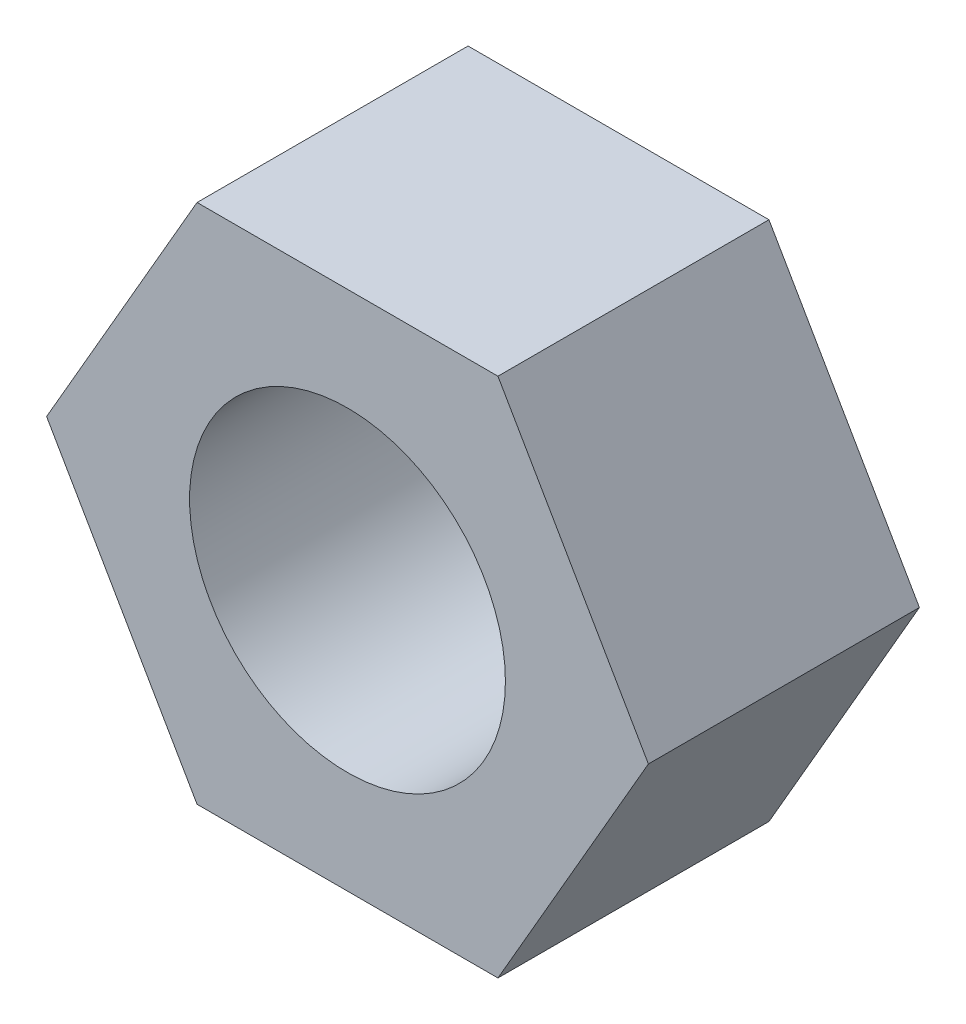
ISO-10303-21;
HEADER;
FILE_DESCRIPTION(('STEP AP214'),'2;1');
FILE_NAME('part.step','',(''),(''),'','','');
FILE_SCHEMA(('AUTOMOTIVE_DESIGN { 1 0 10303 214 1 1 1 1 }'));
ENDSEC;
DATA;
#1=APPLICATION_CONTEXT('core data for automotive mechanical design processes');
#2=APPLICATION_PROTOCOL_DEFINITION('international standard','automotive_design',2000,#1);
#3=PRODUCT_CONTEXT('',#1,'mechanical');
#4=PRODUCT('Part','Part','',(#3));
#5=PRODUCT_RELATED_PRODUCT_CATEGORY('part','',(#4));
#6=PRODUCT_DEFINITION_FORMATION('','',#4);
#7=PRODUCT_DEFINITION_CONTEXT('part definition',#1,'design');
#8=PRODUCT_DEFINITION('design','',#6,#7);
#9=PRODUCT_DEFINITION_SHAPE('','',#8);
#10=(LENGTH_UNIT() NAMED_UNIT(*) SI_UNIT(.MILLI.,.METRE.));
#11=(NAMED_UNIT(*) PLANE_ANGLE_UNIT() SI_UNIT($,.RADIAN.));
#12=(NAMED_UNIT(*) SI_UNIT($,.STERADIAN.) SOLID_ANGLE_UNIT());
#13=UNCERTAINTY_MEASURE_WITH_UNIT(LENGTH_MEASURE(1.E-05),#10,'distance_accuracy_value','');
#14=(GEOMETRIC_REPRESENTATION_CONTEXT(3) GLOBAL_UNCERTAINTY_ASSIGNED_CONTEXT((#13)) GLOBAL_UNIT_ASSIGNED_CONTEXT((#10,
#11,#12)) REPRESENTATION_CONTEXT('',''));
#15=CARTESIAN_POINT('',(0.,0.,0.));
#16=DIRECTION('',(0.,0.,1.));
#17=DIRECTION('',(1.,0.,0.));
#18=AXIS2_PLACEMENT_3D('',#15,#16,#17);
#19=CARTESIAN_POINT('',(0.,0.,5.2));
#20=DIRECTION('',(0.,0.,1.));
#21=DIRECTION('',(1.,0.,0.));
#22=AXIS2_PLACEMENT_3D('',#19,#20,#21);
#23=PLANE('',#22);
#24=DIRECTION('',(0.5,0.866025403784439,0.));
#25=VECTOR('',#24,1.);
#26=CARTESIAN_POINT('',(2.88675134594813,-5.,5.2));
#27=LINE('',#26,#25);
#28=CARTESIAN_POINT('',(2.88675134594813,-5.,5.2));
#29=VERTEX_POINT('',#28);
#30=CARTESIAN_POINT('',(5.77350269189626,0.,5.2));
#31=VERTEX_POINT('',#30);
#32=EDGE_CURVE('E133',#29,#31,#27,.T.);
#33=ORIENTED_EDGE('',*,*,#32,.T.);
#34=DIRECTION('',(-0.5,0.866025403784439,0.));
#35=VECTOR('',#34,1.);
#36=CARTESIAN_POINT('',(5.77350269189626,0.,5.2));
#37=LINE('',#36,#35);
#38=CARTESIAN_POINT('',(2.88675134594813,5.,5.2));
#39=VERTEX_POINT('',#38);
#40=EDGE_CURVE('E91',#31,#39,#37,.T.);
#41=ORIENTED_EDGE('',*,*,#40,.T.);
#42=DIRECTION('',(-1.,0.,0.));
#43=VECTOR('',#42,1.);
#44=CARTESIAN_POINT('',(2.88675134594813,5.,5.2));
#45=LINE('',#44,#43);
#46=CARTESIAN_POINT('',(-2.88675134594813,5.,5.2));
#47=VERTEX_POINT('',#46);
#48=EDGE_CURVE('E106',#39,#47,#45,.T.);
#49=ORIENTED_EDGE('',*,*,#48,.T.);
#50=DIRECTION('',(-0.5,-0.866025403784439,0.));
#51=VECTOR('',#50,1.);
#52=CARTESIAN_POINT('',(-2.88675134594813,5.,5.2));
#53=LINE('',#52,#51);
#54=CARTESIAN_POINT('',(-5.77350269189626,0.,5.2));
#55=VERTEX_POINT('',#54);
#56=EDGE_CURVE('E99',#47,#55,#53,.T.);
#57=ORIENTED_EDGE('',*,*,#56,.T.);
#58=DIRECTION('',(0.5,-0.866025403784439,0.));
#59=VECTOR('',#58,1.);
#60=CARTESIAN_POINT('',(-5.77350269189626,0.,5.2));
#61=LINE('',#60,#59);
#62=CARTESIAN_POINT('',(-2.88675134594813,-5.,5.2));
#63=VERTEX_POINT('',#62);
#64=EDGE_CURVE('E102',#55,#63,#61,.T.);
#65=ORIENTED_EDGE('',*,*,#64,.T.);
#66=DIRECTION('',(1.,0.,0.));
#67=VECTOR('',#66,1.);
#68=CARTESIAN_POINT('',(-2.88675134594813,-5.,5.2));
#69=LINE('',#68,#67);
#70=EDGE_CURVE('E57',#63,#29,#69,.T.);
#71=ORIENTED_EDGE('',*,*,#70,.T.);
#72=EDGE_LOOP('',(#33,#41,#49,#57,#65,#71));
#73=FACE_BOUND('',#72,.T.);
#74=CARTESIAN_POINT('',(0.,0.,5.2));
#75=DIRECTION('',(0.,0.,1.));
#76=DIRECTION('',(1.,0.,0.));
#77=AXIS2_PLACEMENT_3D('',#74,#75,#76);
#78=CIRCLE('',#77,3.03);
#79=CARTESIAN_POINT('',(3.03,0.,5.2));
#80=VERTEX_POINT('',#79);
#81=EDGE_CURVE('E126',#80,#80,#78,.T.);
#82=ORIENTED_EDGE('',*,*,#81,.F.);
#83=EDGE_LOOP('',(#82));
#84=FACE_BOUND('',#83,.T.);
#85=ADVANCED_FACE('F39',(#73,#84),#23,.T.);
#86=CARTESIAN_POINT('',(0.,0.,0.));
#87=DIRECTION('',(0.,0.,1.));
#88=DIRECTION('',(1.,0.,0.));
#89=AXIS2_PLACEMENT_3D('',#86,#87,#88);
#90=PLANE('',#89);
#91=DIRECTION('',(0.5,0.866025403784439,0.));
#92=VECTOR('',#91,1.);
#93=CARTESIAN_POINT('',(2.88675134594813,-5.,0.));
#94=LINE('',#93,#92);
#95=CARTESIAN_POINT('',(2.88675134594813,-5.,0.));
#96=VERTEX_POINT('',#95);
#97=CARTESIAN_POINT('',(5.77350269189626,0.,0.));
#98=VERTEX_POINT('',#97);
#99=EDGE_CURVE('E123',#96,#98,#94,.T.);
#100=ORIENTED_EDGE('',*,*,#99,.F.);
#101=DIRECTION('',(1.,0.,0.));
#102=VECTOR('',#101,1.);
#103=CARTESIAN_POINT('',(-2.88675134594813,-5.,0.));
#104=LINE('',#103,#102);
#105=CARTESIAN_POINT('',(-2.88675134594813,-5.,0.));
#106=VERTEX_POINT('',#105);
#107=EDGE_CURVE('E84',#106,#96,#104,.T.);
#108=ORIENTED_EDGE('',*,*,#107,.F.);
#109=DIRECTION('',(0.5,-0.866025403784439,0.));
#110=VECTOR('',#109,1.);
#111=CARTESIAN_POINT('',(-5.77350269189626,0.,0.));
#112=LINE('',#111,#110);
#113=CARTESIAN_POINT('',(-5.77350269189626,0.,0.));
#114=VERTEX_POINT('',#113);
#115=EDGE_CURVE('E76',#114,#106,#112,.T.);
#116=ORIENTED_EDGE('',*,*,#115,.F.);
#117=DIRECTION('',(-0.5,-0.866025403784439,0.));
#118=VECTOR('',#117,1.);
#119=CARTESIAN_POINT('',(-2.88675134594813,5.,0.));
#120=LINE('',#119,#118);
#121=CARTESIAN_POINT('',(-2.88675134594813,5.,0.));
#122=VERTEX_POINT('',#121);
#123=EDGE_CURVE('E111',#122,#114,#120,.T.);
#124=ORIENTED_EDGE('',*,*,#123,.F.);
#125=DIRECTION('',(-1.,0.,0.));
#126=VECTOR('',#125,1.);
#127=CARTESIAN_POINT('',(2.88675134594813,5.,0.));
#128=LINE('',#127,#126);
#129=CARTESIAN_POINT('',(2.88675134594813,5.,0.));
#130=VERTEX_POINT('',#129);
#131=EDGE_CURVE('E128',#130,#122,#128,.T.);
#132=ORIENTED_EDGE('',*,*,#131,.F.);
#133=DIRECTION('',(-0.5,0.866025403784439,0.));
#134=VECTOR('',#133,1.);
#135=CARTESIAN_POINT('',(5.77350269189626,0.,0.));
#136=LINE('',#135,#134);
#137=EDGE_CURVE('E130',#98,#130,#136,.T.);
#138=ORIENTED_EDGE('',*,*,#137,.F.);
#139=EDGE_LOOP('',(#100,#108,#116,#124,#132,#138));
#140=FACE_BOUND('',#139,.T.);
#141=CARTESIAN_POINT('',(0.,0.,0.));
#142=DIRECTION('',(0.,0.,1.));
#143=DIRECTION('',(1.,0.,0.));
#144=AXIS2_PLACEMENT_3D('',#141,#142,#143);
#145=CIRCLE('',#144,3.03);
#146=CARTESIAN_POINT('',(3.03,0.,0.));
#147=VERTEX_POINT('',#146);
#148=EDGE_CURVE('E229',#147,#147,#145,.T.);
#149=ORIENTED_EDGE('',*,*,#148,.T.);
#150=EDGE_LOOP('',(#149));
#151=FACE_BOUND('',#150,.T.);
#152=ADVANCED_FACE('F145',(#140,#151),#90,.F.);
#153=CARTESIAN_POINT('',(2.88675134594813,-5.,5.2));
#154=DIRECTION('',(-0.866025403784439,0.5,0.));
#155=DIRECTION('',(-0.5,-0.866025403784439,0.));
#156=AXIS2_PLACEMENT_3D('',#153,#154,#155);
#157=PLANE('',#156);
#158=ORIENTED_EDGE('',*,*,#99,.T.);
#159=DIRECTION('',(0.,0.,-1.));
#160=VECTOR('',#159,1.);
#161=CARTESIAN_POINT('',(5.77350269189626,0.,5.2));
#162=LINE('',#161,#160);
#163=EDGE_CURVE('E11',#31,#98,#162,.T.);
#164=ORIENTED_EDGE('',*,*,#163,.F.);
#165=ORIENTED_EDGE('',*,*,#32,.F.);
#166=DIRECTION('',(0.,0.,-1.));
#167=VECTOR('',#166,1.);
#168=CARTESIAN_POINT('',(2.88675134594813,-5.,5.2));
#169=LINE('',#168,#167);
#170=EDGE_CURVE('E118',#29,#96,#169,.T.);
#171=ORIENTED_EDGE('',*,*,#170,.T.);
#172=EDGE_LOOP('',(#158,#164,#165,#171));
#173=FACE_BOUND('',#172,.T.);
#174=ADVANCED_FACE('F41',(#173),#157,.F.);
#175=CARTESIAN_POINT('',(5.77350269189626,0.,5.2));
#176=DIRECTION('',(-0.866025403784439,-0.5,0.));
#177=DIRECTION('',(0.5,-0.866025403784439,0.));
#178=AXIS2_PLACEMENT_3D('',#175,#176,#177);
#179=PLANE('',#178);
#180=ORIENTED_EDGE('',*,*,#137,.T.);
#181=DIRECTION('',(0.,0.,-1.));
#182=VECTOR('',#181,1.);
#183=CARTESIAN_POINT('',(2.88675134594813,5.,5.2));
#184=LINE('',#183,#182);
#185=EDGE_CURVE('E48',#39,#130,#184,.T.);
#186=ORIENTED_EDGE('',*,*,#185,.F.);
#187=ORIENTED_EDGE('',*,*,#40,.F.);
#188=ORIENTED_EDGE('',*,*,#163,.T.);
#189=EDGE_LOOP('',(#180,#186,#187,#188));
#190=FACE_BOUND('',#189,.T.);
#191=ADVANCED_FACE('F166',(#190),#179,.F.);
#192=CARTESIAN_POINT('',(2.88675134594813,5.,5.2));
#193=DIRECTION('',(0.,-1.,0.));
#194=DIRECTION('',(1.,0.,0.));
#195=AXIS2_PLACEMENT_3D('',#192,#193,#194);
#196=PLANE('',#195);
#197=ORIENTED_EDGE('',*,*,#131,.T.);
#198=DIRECTION('',(0.,0.,-1.));
#199=VECTOR('',#198,1.);
#200=CARTESIAN_POINT('',(-2.88675134594813,5.,5.2));
#201=LINE('',#200,#199);
#202=EDGE_CURVE('E113',#47,#122,#201,.T.);
#203=ORIENTED_EDGE('',*,*,#202,.F.);
#204=ORIENTED_EDGE('',*,*,#48,.F.);
#205=ORIENTED_EDGE('',*,*,#185,.T.);
#206=EDGE_LOOP('',(#197,#203,#204,#205));
#207=FACE_BOUND('',#206,.T.);
#208=ADVANCED_FACE('F143',(#207),#196,.F.);
#209=CARTESIAN_POINT('',(-2.88675134594813,5.,5.2));
#210=DIRECTION('',(0.866025403784439,-0.5,0.));
#211=DIRECTION('',(0.5,0.866025403784439,0.));
#212=AXIS2_PLACEMENT_3D('',#209,#210,#211);
#213=PLANE('',#212);
#214=ORIENTED_EDGE('',*,*,#123,.T.);
#215=DIRECTION('',(0.,0.,-1.));
#216=VECTOR('',#215,1.);
#217=CARTESIAN_POINT('',(-5.77350269189626,0.,5.2));
#218=LINE('',#217,#216);
#219=EDGE_CURVE('E112',#55,#114,#218,.T.);
#220=ORIENTED_EDGE('',*,*,#219,.F.);
#221=ORIENTED_EDGE('',*,*,#56,.F.);
#222=ORIENTED_EDGE('',*,*,#202,.T.);
#223=EDGE_LOOP('',(#214,#220,#221,#222));
#224=FACE_BOUND('',#223,.T.);
#225=ADVANCED_FACE('F115',(#224),#213,.F.);
#226=CARTESIAN_POINT('',(-5.77350269189626,0.,5.2));
#227=DIRECTION('',(0.866025403784439,0.5,0.));
#228=DIRECTION('',(-0.5,0.866025403784439,0.));
#229=AXIS2_PLACEMENT_3D('',#226,#227,#228);
#230=PLANE('',#229);
#231=ORIENTED_EDGE('',*,*,#115,.T.);
#232=DIRECTION('',(0.,0.,-1.));
#233=VECTOR('',#232,1.);
#234=CARTESIAN_POINT('',(-2.88675134594813,-5.,5.2));
#235=LINE('',#234,#233);
#236=EDGE_CURVE('E117',#63,#106,#235,.T.);
#237=ORIENTED_EDGE('',*,*,#236,.F.);
#238=ORIENTED_EDGE('',*,*,#64,.F.);
#239=ORIENTED_EDGE('',*,*,#219,.T.);
#240=EDGE_LOOP('',(#231,#237,#238,#239));
#241=FACE_BOUND('',#240,.T.);
#242=ADVANCED_FACE('F119',(#241),#230,.F.);
#243=CARTESIAN_POINT('',(-2.88675134594813,-5.,5.2));
#244=DIRECTION('',(0.,1.,0.));
#245=DIRECTION('',(-1.,0.,0.));
#246=AXIS2_PLACEMENT_3D('',#243,#244,#245);
#247=PLANE('',#246);
#248=ORIENTED_EDGE('',*,*,#107,.T.);
#249=ORIENTED_EDGE('',*,*,#170,.F.);
#250=ORIENTED_EDGE('',*,*,#70,.F.);
#251=ORIENTED_EDGE('',*,*,#236,.T.);
#252=EDGE_LOOP('',(#248,#249,#250,#251));
#253=FACE_BOUND('',#252,.T.);
#254=ADVANCED_FACE('F149',(#253),#247,.F.);
#255=CARTESIAN_POINT('',(0.,0.,5.2));
#256=DIRECTION('',(0.,0.,-1.));
#257=DIRECTION('',(-1.,0.,0.));
#258=AXIS2_PLACEMENT_3D('',#255,#256,#257);
#259=CYLINDRICAL_SURFACE('',#258,3.03);
#260=ORIENTED_EDGE('',*,*,#81,.T.);
#261=EDGE_LOOP('',(#260));
#262=FACE_BOUND('',#261,.T.);
#263=ORIENTED_EDGE('',*,*,#148,.F.);
#264=EDGE_LOOP('',(#263));
#265=FACE_BOUND('',#264,.T.);
#266=ADVANCED_FACE('F151',(#262,#265),#259,.F.);
#267=CLOSED_SHELL('',(#85,#152,#174,#191,#208,#225,#242,#254,#266));
#268=MANIFOLD_SOLID_BREP('B2',#267);
#269=ADVANCED_BREP_SHAPE_REPRESENTATION('',(#18,#268),#14);
#270=SHAPE_DEFINITION_REPRESENTATION(#9,#269);
ENDSEC;
END-ISO-10303-21;
